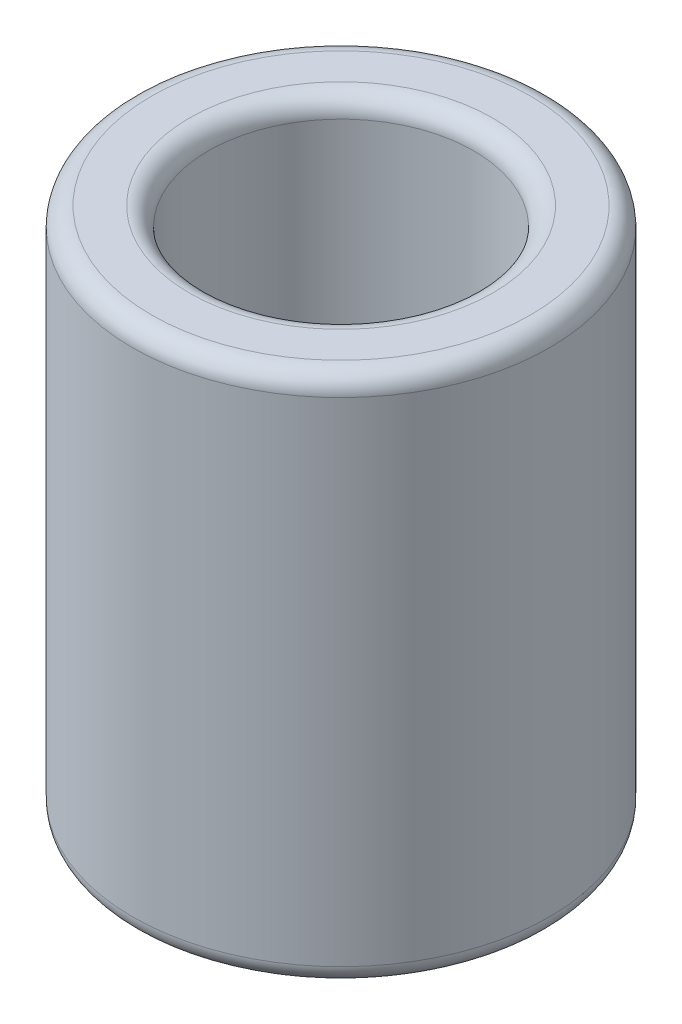
ISO-10303-21;
HEADER;
FILE_DESCRIPTION(('STEP AP214'),'2;1');
FILE_NAME('part.step','',(''),(''),'','','');
FILE_SCHEMA(('AUTOMOTIVE_DESIGN { 1 0 10303 214 1 1 1 1 }'));
ENDSEC;
DATA;
#1=APPLICATION_CONTEXT('core data for automotive mechanical design processes');
#2=APPLICATION_PROTOCOL_DEFINITION('international standard','automotive_design',2000,#1);
#3=PRODUCT_CONTEXT('',#1,'mechanical');
#4=PRODUCT('Part','Part','',(#3));
#5=PRODUCT_RELATED_PRODUCT_CATEGORY('part','',(#4));
#6=PRODUCT_DEFINITION_FORMATION('','',#4);
#7=PRODUCT_DEFINITION_CONTEXT('part definition',#1,'design');
#8=PRODUCT_DEFINITION('design','',#6,#7);
#9=PRODUCT_DEFINITION_SHAPE('','',#8);
#10=(LENGTH_UNIT() NAMED_UNIT(*) SI_UNIT(.MILLI.,.METRE.));
#11=(NAMED_UNIT(*) PLANE_ANGLE_UNIT() SI_UNIT($,.RADIAN.));
#12=(NAMED_UNIT(*) SI_UNIT($,.STERADIAN.) SOLID_ANGLE_UNIT());
#13=UNCERTAINTY_MEASURE_WITH_UNIT(LENGTH_MEASURE(1.E-05),#10,'distance_accuracy_value','');
#14=(GEOMETRIC_REPRESENTATION_CONTEXT(3) GLOBAL_UNCERTAINTY_ASSIGNED_CONTEXT((#13)) GLOBAL_UNIT_ASSIGNED_CONTEXT((#10,
#11,#12)) REPRESENTATION_CONTEXT('',''));
#15=CARTESIAN_POINT('',(0.,0.,0.));
#16=DIRECTION('',(0.,0.,1.));
#17=DIRECTION('',(1.,0.,0.));
#18=AXIS2_PLACEMENT_3D('',#15,#16,#17);
#19=CARTESIAN_POINT('',(0.,7.,0.));
#20=DIRECTION('',(0.,1.,0.));
#21=DIRECTION('',(0.,0.,1.));
#22=AXIS2_PLACEMENT_3D('',#19,#20,#21);
#23=PLANE('',#22);
#24=CARTESIAN_POINT('',(0.,7.,0.));
#25=DIRECTION('',(0.,1.,0.));
#26=DIRECTION('',(0.,0.,1.));
#27=AXIS2_PLACEMENT_3D('',#24,#25,#26);
#28=CIRCLE('',#27,2.);
#29=CARTESIAN_POINT('',(0.,7.,2.));
#30=VERTEX_POINT('',#29);
#31=EDGE_CURVE('E10',#30,#30,#28,.F.);
#32=ORIENTED_EDGE('',*,*,#31,.T.);
#33=EDGE_LOOP('',(#32));
#34=FACE_BOUND('',#33,.T.);
#35=CARTESIAN_POINT('',(0.,7.,0.));
#36=DIRECTION('',(0.,1.,0.));
#37=DIRECTION('',(0.,0.,1.));
#38=AXIS2_PLACEMENT_3D('',#35,#36,#37);
#39=CIRCLE('',#38,2.5);
#40=CARTESIAN_POINT('',(0.,7.,2.5));
#41=VERTEX_POINT('',#40);
#42=EDGE_CURVE('E42',#41,#41,#39,.T.);
#43=ORIENTED_EDGE('',*,*,#42,.T.);
#44=EDGE_LOOP('',(#43));
#45=FACE_BOUND('',#44,.T.);
#46=ADVANCED_FACE('F40',(#34,#45),#23,.T.);
#47=CARTESIAN_POINT('',(0.,0.,0.));
#48=DIRECTION('',(0.,1.,0.));
#49=DIRECTION('',(0.,0.,1.));
#50=AXIS2_PLACEMENT_3D('',#47,#48,#49);
#51=PLANE('',#50);
#52=CARTESIAN_POINT('',(0.,0.,0.));
#53=DIRECTION('',(0.,1.,0.));
#54=DIRECTION('',(0.,0.,1.));
#55=AXIS2_PLACEMENT_3D('',#52,#53,#54);
#56=CIRCLE('',#55,2.);
#57=CARTESIAN_POINT('',(0.,0.,2.));
#58=VERTEX_POINT('',#57);
#59=EDGE_CURVE('E65',#58,#58,#56,.T.);
#60=ORIENTED_EDGE('',*,*,#59,.T.);
#61=EDGE_LOOP('',(#60));
#62=FACE_BOUND('',#61,.T.);
#63=CARTESIAN_POINT('',(0.,0.,0.));
#64=DIRECTION('',(0.,1.,0.));
#65=DIRECTION('',(0.,0.,1.));
#66=AXIS2_PLACEMENT_3D('',#63,#64,#65);
#67=CIRCLE('',#66,2.5);
#68=CARTESIAN_POINT('',(0.,0.,2.5));
#69=VERTEX_POINT('',#68);
#70=EDGE_CURVE('E66',#69,#69,#67,.F.);
#71=ORIENTED_EDGE('',*,*,#70,.T.);
#72=EDGE_LOOP('',(#71));
#73=FACE_BOUND('',#72,.T.);
#74=ADVANCED_FACE('F70',(#62,#73),#51,.F.);
#75=CARTESIAN_POINT('',(0.,7.,0.));
#76=DIRECTION('',(0.,-1.,0.));
#77=DIRECTION('',(0.,0.,-1.));
#78=AXIS2_PLACEMENT_3D('',#75,#76,#77);
#79=CYLINDRICAL_SURFACE('',#78,2.75);
#80=CARTESIAN_POINT('',(0.,0.25,0.));
#81=DIRECTION('',(0.,1.,0.));
#82=DIRECTION('',(0.,0.,1.));
#83=AXIS2_PLACEMENT_3D('',#80,#81,#82);
#84=CIRCLE('',#83,2.75);
#85=CARTESIAN_POINT('',(0.,0.25,2.75));
#86=VERTEX_POINT('',#85);
#87=EDGE_CURVE('E48',#86,#86,#84,.T.);
#88=ORIENTED_EDGE('',*,*,#87,.T.);
#89=EDGE_LOOP('',(#88));
#90=FACE_BOUND('',#89,.T.);
#91=CARTESIAN_POINT('',(0.,6.75,0.));
#92=DIRECTION('',(0.,1.,0.));
#93=DIRECTION('',(0.,0.,1.));
#94=AXIS2_PLACEMENT_3D('',#91,#92,#93);
#95=CIRCLE('',#94,2.75);
#96=CARTESIAN_POINT('',(0.,6.75,2.75));
#97=VERTEX_POINT('',#96);
#98=EDGE_CURVE('E55',#97,#97,#95,.F.);
#99=ORIENTED_EDGE('',*,*,#98,.T.);
#100=EDGE_LOOP('',(#99));
#101=FACE_BOUND('',#100,.T.);
#102=ADVANCED_FACE('F77',(#90,#101),#79,.T.);
#103=CARTESIAN_POINT('',(0.,7.,0.));
#104=DIRECTION('',(0.,-1.,0.));
#105=DIRECTION('',(0.,0.,-1.));
#106=AXIS2_PLACEMENT_3D('',#103,#104,#105);
#107=CYLINDRICAL_SURFACE('',#106,1.75);
#108=CARTESIAN_POINT('',(0.,0.25,0.));
#109=DIRECTION('',(0.,1.,0.));
#110=DIRECTION('',(0.,0.,1.));
#111=AXIS2_PLACEMENT_3D('',#108,#109,#110);
#112=CIRCLE('',#111,1.75);
#113=CARTESIAN_POINT('',(0.,0.25,1.75));
#114=VERTEX_POINT('',#113);
#115=EDGE_CURVE('E60',#114,#114,#112,.F.);
#116=ORIENTED_EDGE('',*,*,#115,.T.);
#117=EDGE_LOOP('',(#116));
#118=FACE_BOUND('',#117,.T.);
#119=CARTESIAN_POINT('',(0.,6.75,0.));
#120=DIRECTION('',(0.,1.,0.));
#121=DIRECTION('',(0.,0.,1.));
#122=AXIS2_PLACEMENT_3D('',#119,#120,#121);
#123=CIRCLE('',#122,1.75);
#124=CARTESIAN_POINT('',(0.,6.75,1.75));
#125=VERTEX_POINT('',#124);
#126=EDGE_CURVE('E58',#125,#125,#123,.T.);
#127=ORIENTED_EDGE('',*,*,#126,.T.);
#128=EDGE_LOOP('',(#127));
#129=FACE_BOUND('',#128,.T.);
#130=ADVANCED_FACE('F84',(#118,#129),#107,.F.);
#131=CARTESIAN_POINT('',(0.,0.25,0.));
#132=DIRECTION('',(0.,1.,0.));
#133=DIRECTION('',(0.,0.,1.));
#134=AXIS2_PLACEMENT_3D('',#131,#132,#133);
#135=TOROIDAL_SURFACE('',#134,2.,0.25);
#136=ORIENTED_EDGE('',*,*,#115,.F.);
#137=EDGE_LOOP('',(#136));
#138=FACE_BOUND('',#137,.T.);
#139=ORIENTED_EDGE('',*,*,#59,.F.);
#140=EDGE_LOOP('',(#139));
#141=FACE_BOUND('',#140,.T.);
#142=ADVANCED_FACE('F79',(#138,#141),#135,.T.);
#143=CARTESIAN_POINT('',(0.,0.25,0.));
#144=DIRECTION('',(0.,1.,0.));
#145=DIRECTION('',(0.,0.,1.));
#146=AXIS2_PLACEMENT_3D('',#143,#144,#145);
#147=TOROIDAL_SURFACE('',#146,2.5,0.25);
#148=ORIENTED_EDGE('',*,*,#70,.F.);
#149=EDGE_LOOP('',(#148));
#150=FACE_BOUND('',#149,.T.);
#151=ORIENTED_EDGE('',*,*,#87,.F.);
#152=EDGE_LOOP('',(#151));
#153=FACE_BOUND('',#152,.T.);
#154=ADVANCED_FACE('F75',(#150,#153),#147,.T.);
#155=CARTESIAN_POINT('',(0.,6.75,0.));
#156=DIRECTION('',(0.,1.,0.));
#157=DIRECTION('',(0.,0.,1.));
#158=AXIS2_PLACEMENT_3D('',#155,#156,#157);
#159=TOROIDAL_SURFACE('',#158,2.,0.25);
#160=ORIENTED_EDGE('',*,*,#31,.F.);
#161=EDGE_LOOP('',(#160));
#162=FACE_BOUND('',#161,.T.);
#163=ORIENTED_EDGE('',*,*,#126,.F.);
#164=EDGE_LOOP('',(#163));
#165=FACE_BOUND('',#164,.T.);
#166=ADVANCED_FACE('F73',(#162,#165),#159,.T.);
#167=CARTESIAN_POINT('',(0.,6.75,0.));
#168=DIRECTION('',(0.,1.,0.));
#169=DIRECTION('',(0.,0.,1.));
#170=AXIS2_PLACEMENT_3D('',#167,#168,#169);
#171=TOROIDAL_SURFACE('',#170,2.5,0.25);
#172=ORIENTED_EDGE('',*,*,#98,.F.);
#173=EDGE_LOOP('',(#172));
#174=FACE_BOUND('',#173,.T.);
#175=ORIENTED_EDGE('',*,*,#42,.F.);
#176=EDGE_LOOP('',(#175));
#177=FACE_BOUND('',#176,.T.);
#178=ADVANCED_FACE('F39',(#174,#177),#171,.T.);
#179=CLOSED_SHELL('',(#46,#74,#102,#130,#142,#154,#166,#178));
#180=MANIFOLD_SOLID_BREP('B2',#179);
#181=ADVANCED_BREP_SHAPE_REPRESENTATION('',(#18,#180),#14);
#182=SHAPE_DEFINITION_REPRESENTATION(#9,#181);
ENDSEC;
END-ISO-10303-21;
